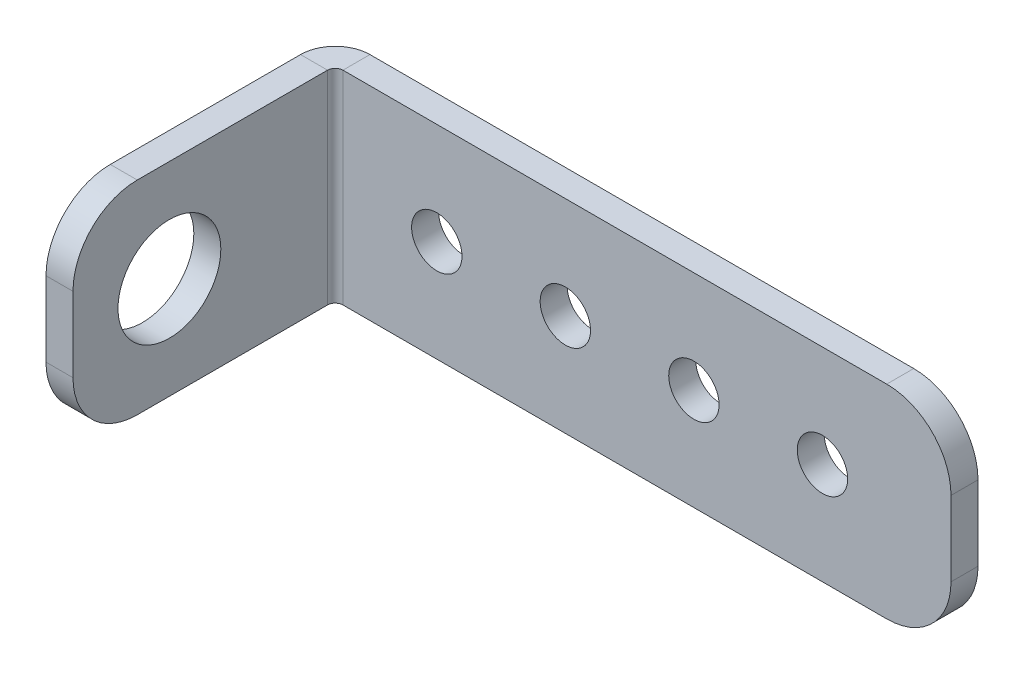
ISO-10303-21;
HEADER;
FILE_DESCRIPTION(('STEP AP214'),'2;1');
FILE_NAME('part.step','',(''),(''),'','','');
FILE_SCHEMA(('AUTOMOTIVE_DESIGN { 1 0 10303 214 1 1 1 1 }'));
ENDSEC;
DATA;
#1=APPLICATION_CONTEXT('core data for automotive mechanical design processes');
#2=APPLICATION_PROTOCOL_DEFINITION('international standard','automotive_design',2000,#1);
#3=PRODUCT_CONTEXT('',#1,'mechanical');
#4=PRODUCT('Part','Part','',(#3));
#5=PRODUCT_RELATED_PRODUCT_CATEGORY('part','',(#4));
#6=PRODUCT_DEFINITION_FORMATION('','',#4);
#7=PRODUCT_DEFINITION_CONTEXT('part definition',#1,'design');
#8=PRODUCT_DEFINITION('design','',#6,#7);
#9=PRODUCT_DEFINITION_SHAPE('','',#8);
#10=(LENGTH_UNIT() NAMED_UNIT(*) SI_UNIT(.MILLI.,.METRE.));
#11=(NAMED_UNIT(*) PLANE_ANGLE_UNIT() SI_UNIT($,.RADIAN.));
#12=(NAMED_UNIT(*) SI_UNIT($,.STERADIAN.) SOLID_ANGLE_UNIT());
#13=UNCERTAINTY_MEASURE_WITH_UNIT(LENGTH_MEASURE(1.E-05),#10,'distance_accuracy_value','');
#14=(GEOMETRIC_REPRESENTATION_CONTEXT(3) GLOBAL_UNCERTAINTY_ASSIGNED_CONTEXT((#13)) GLOBAL_UNIT_ASSIGNED_CONTEXT((#10,
#11,#12)) REPRESENTATION_CONTEXT('',''));
#15=CARTESIAN_POINT('',(0.,0.,0.));
#16=DIRECTION('',(0.,0.,1.));
#17=DIRECTION('',(1.,0.,0.));
#18=AXIS2_PLACEMENT_3D('',#15,#16,#17);
#19=CARTESIAN_POINT('',(3.429,20.0914,0.));
#20=DIRECTION('',(0.,1.,0.));
#21=DIRECTION('',(0.,0.,1.));
#22=AXIS2_PLACEMENT_3D('',#19,#20,#21);
#23=PLANE('',#22);
#24=DIRECTION('',(0.,0.,1.));
#25=VECTOR('',#24,1.);
#26=CARTESIAN_POINT('',(3.429,20.0914,0.));
#27=LINE('',#26,#25);
#28=CARTESIAN_POINT('',(3.429,20.0914,0.));
#29=VERTEX_POINT('',#28);
#30=CARTESIAN_POINT('',(3.429,20.0914,2.667));
#31=VERTEX_POINT('',#30);
#32=EDGE_CURVE('E135',#29,#31,#27,.T.);
#33=ORIENTED_EDGE('',*,*,#32,.F.);
#34=CARTESIAN_POINT('',(3.429,20.0914,3.429));
#35=DIRECTION('',(0.,1.,0.));
#36=DIRECTION('',(0.,0.,1.));
#37=AXIS2_PLACEMENT_3D('',#34,#35,#36);
#38=CIRCLE('',#37,3.429);
#39=CARTESIAN_POINT('',(0.,20.0914,3.429));
#40=VERTEX_POINT('',#39);
#41=EDGE_CURVE('E139',#40,#29,#38,.F.);
#42=ORIENTED_EDGE('',*,*,#41,.F.);
#43=DIRECTION('',(-1.,0.,0.));
#44=VECTOR('',#43,1.);
#45=CARTESIAN_POINT('',(2.667,20.0914,3.429));
#46=LINE('',#45,#44);
#47=CARTESIAN_POINT('',(2.667,20.0914,3.429));
#48=VERTEX_POINT('',#47);
#49=EDGE_CURVE('E147',#48,#40,#46,.T.);
#50=ORIENTED_EDGE('',*,*,#49,.F.);
#51=CARTESIAN_POINT('',(3.429,20.0914,3.429));
#52=DIRECTION('',(0.,1.,0.));
#53=DIRECTION('',(1.,0.,0.));
#54=AXIS2_PLACEMENT_3D('',#51,#52,#53);
#55=CIRCLE('',#54,0.762);
#56=EDGE_CURVE('E141',#48,#31,#55,.F.);
#57=ORIENTED_EDGE('',*,*,#56,.T.);
#58=EDGE_LOOP('',(#33,#42,#50,#57));
#59=FACE_BOUND('',#58,.T.);
#60=ADVANCED_FACE('F45',(#59),#23,.T.);
#61=CARTESIAN_POINT('',(2.667,20.0914,3.429));
#62=DIRECTION('',(0.,1.,0.));
#63=DIRECTION('',(0.,0.,1.));
#64=AXIS2_PLACEMENT_3D('',#61,#62,#63);
#65=PLANE('',#64);
#66=DIRECTION('',(1.,0.,0.));
#67=VECTOR('',#66,1.);
#68=CARTESIAN_POINT('',(0.,20.0914,2.667));
#69=LINE('',#68,#67);
#70=CARTESIAN_POINT('',(57.15,20.0914,2.667));
#71=VERTEX_POINT('',#70);
#72=EDGE_CURVE('E168',#31,#71,#69,.T.);
#73=ORIENTED_EDGE('',*,*,#72,.T.);
#74=DIRECTION('',(0.,0.,1.));
#75=VECTOR('',#74,1.);
#76=CARTESIAN_POINT('',(57.15,20.0914,3.429));
#77=LINE('',#76,#75);
#78=CARTESIAN_POINT('',(57.15,20.0914,0.));
#79=VERTEX_POINT('',#78);
#80=EDGE_CURVE('E167',#71,#79,#77,.F.);
#81=ORIENTED_EDGE('',*,*,#80,.T.);
#82=DIRECTION('',(1.,0.,0.));
#83=VECTOR('',#82,1.);
#84=CARTESIAN_POINT('',(0.,20.0914,0.));
#85=LINE('',#84,#83);
#86=EDGE_CURVE('E155',#29,#79,#85,.T.);
#87=ORIENTED_EDGE('',*,*,#86,.F.);
#88=ORIENTED_EDGE('',*,*,#32,.T.);
#89=EDGE_LOOP('',(#73,#81,#87,#88));
#90=FACE_BOUND('',#89,.T.);
#91=ADVANCED_FACE('F165',(#90),#65,.T.);
#92=CARTESIAN_POINT('',(0.,0.,3.429));
#93=DIRECTION('',(0.,-1.,0.));
#94=DIRECTION('',(0.,0.,-1.));
#95=AXIS2_PLACEMENT_3D('',#92,#93,#94);
#96=PLANE('',#95);
#97=DIRECTION('',(1.,0.,0.));
#98=VECTOR('',#97,1.);
#99=CARTESIAN_POINT('',(0.,0.,3.429));
#100=LINE('',#99,#98);
#101=CARTESIAN_POINT('',(0.,0.,3.429));
#102=VERTEX_POINT('',#101);
#103=CARTESIAN_POINT('',(2.667,0.,3.429));
#104=VERTEX_POINT('',#103);
#105=EDGE_CURVE('E213',#102,#104,#100,.T.);
#106=ORIENTED_EDGE('',*,*,#105,.F.);
#107=CARTESIAN_POINT('',(3.429,0.,3.429));
#108=DIRECTION('',(0.,1.,0.));
#109=DIRECTION('',(0.,0.,1.));
#110=AXIS2_PLACEMENT_3D('',#107,#108,#109);
#111=CIRCLE('',#110,3.429);
#112=CARTESIAN_POINT('',(3.429,0.,0.));
#113=VERTEX_POINT('',#112);
#114=EDGE_CURVE('E187',#102,#113,#111,.F.);
#115=ORIENTED_EDGE('',*,*,#114,.T.);
#116=DIRECTION('',(0.,0.,-1.));
#117=VECTOR('',#116,1.);
#118=CARTESIAN_POINT('',(3.429,0.,2.667));
#119=LINE('',#118,#117);
#120=CARTESIAN_POINT('',(3.429,0.,2.667));
#121=VERTEX_POINT('',#120);
#122=EDGE_CURVE('E211',#121,#113,#119,.T.);
#123=ORIENTED_EDGE('',*,*,#122,.F.);
#124=CARTESIAN_POINT('',(3.429,0.,3.429));
#125=DIRECTION('',(0.,1.,0.));
#126=DIRECTION('',(1.,0.,0.));
#127=AXIS2_PLACEMENT_3D('',#124,#125,#126);
#128=CIRCLE('',#127,0.762);
#129=EDGE_CURVE('E193',#104,#121,#128,.F.);
#130=ORIENTED_EDGE('',*,*,#129,.F.);
#131=EDGE_LOOP('',(#106,#115,#123,#130));
#132=FACE_BOUND('',#131,.T.);
#133=ADVANCED_FACE('F335',(#132),#96,.T.);
#134=CARTESIAN_POINT('',(3.429,0.,2.667));
#135=DIRECTION('',(0.,-1.,0.));
#136=DIRECTION('',(0.,0.,-1.));
#137=AXIS2_PLACEMENT_3D('',#134,#135,#136);
#138=PLANE('',#137);
#139=DIRECTION('',(0.,0.,-1.));
#140=VECTOR('',#139,1.);
#141=CARTESIAN_POINT('',(2.667,0.,28.575));
#142=LINE('',#141,#140);
#143=CARTESIAN_POINT('',(2.667,0.,22.225));
#144=VERTEX_POINT('',#143);
#145=EDGE_CURVE('E191',#144,#104,#142,.T.);
#146=ORIENTED_EDGE('',*,*,#145,.F.);
#147=DIRECTION('',(-1.,0.,0.));
#148=VECTOR('',#147,1.);
#149=CARTESIAN_POINT('',(3.429,0.,22.225));
#150=LINE('',#149,#148);
#151=CARTESIAN_POINT('',(0.,0.,22.225));
#152=VERTEX_POINT('',#151);
#153=EDGE_CURVE('E234',#144,#152,#150,.T.);
#154=ORIENTED_EDGE('',*,*,#153,.T.);
#155=DIRECTION('',(0.,0.,-1.));
#156=VECTOR('',#155,1.);
#157=CARTESIAN_POINT('',(0.,0.,28.575));
#158=LINE('',#157,#156);
#159=EDGE_CURVE('E189',#152,#102,#158,.T.);
#160=ORIENTED_EDGE('',*,*,#159,.T.);
#161=ORIENTED_EDGE('',*,*,#105,.T.);
#162=EDGE_LOOP('',(#146,#154,#160,#161));
#163=FACE_BOUND('',#162,.T.);
#164=ADVANCED_FACE('F254',(#163),#138,.T.);
#165=CARTESIAN_POINT('',(0.,20.0914,2.667));
#166=DIRECTION('',(0.,0.,-1.));
#167=DIRECTION('',(-1.,0.,0.));
#168=AXIS2_PLACEMENT_3D('',#165,#166,#167);
#169=PLANE('',#168);
#170=CARTESIAN_POINT('',(50.8,10.0457,2.667));
#171=DIRECTION('',(0.,0.,-1.));
#172=DIRECTION('',(-1.,0.,0.));
#173=AXIS2_PLACEMENT_3D('',#170,#171,#172);
#174=CIRCLE('',#173,2.4892);
#175=CARTESIAN_POINT('',(48.3108,10.0457,2.667));
#176=VERTEX_POINT('',#175);
#177=EDGE_CURVE('E278',#176,#176,#174,.T.);
#178=ORIENTED_EDGE('',*,*,#177,.T.);
#179=EDGE_LOOP('',(#178));
#180=FACE_BOUND('',#179,.T.);
#181=CARTESIAN_POINT('',(38.1,10.0457,2.667));
#182=DIRECTION('',(0.,0.,-1.));
#183=DIRECTION('',(-1.,0.,0.));
#184=AXIS2_PLACEMENT_3D('',#181,#182,#183);
#185=CIRCLE('',#184,2.48919999999999);
#186=CARTESIAN_POINT('',(35.6108,10.0457,2.667));
#187=VERTEX_POINT('',#186);
#188=EDGE_CURVE('E283',#187,#187,#185,.T.);
#189=ORIENTED_EDGE('',*,*,#188,.T.);
#190=EDGE_LOOP('',(#189));
#191=FACE_BOUND('',#190,.T.);
#192=CARTESIAN_POINT('',(25.4,10.0457,2.667));
#193=DIRECTION('',(0.,0.,-1.));
#194=DIRECTION('',(-1.,0.,0.));
#195=AXIS2_PLACEMENT_3D('',#192,#193,#194);
#196=CIRCLE('',#195,2.4892);
#197=CARTESIAN_POINT('',(22.9108,10.0457,2.667));
#198=VERTEX_POINT('',#197);
#199=EDGE_CURVE('E286',#198,#198,#196,.T.);
#200=ORIENTED_EDGE('',*,*,#199,.T.);
#201=EDGE_LOOP('',(#200));
#202=FACE_BOUND('',#201,.T.);
#203=CARTESIAN_POINT('',(12.7,10.0457,2.667));
#204=DIRECTION('',(0.,0.,-1.));
#205=DIRECTION('',(-1.,0.,0.));
#206=AXIS2_PLACEMENT_3D('',#203,#204,#205);
#207=CIRCLE('',#206,2.4892);
#208=CARTESIAN_POINT('',(10.2108,10.0457,2.667));
#209=VERTEX_POINT('',#208);
#210=EDGE_CURVE('E289',#209,#209,#207,.T.);
#211=ORIENTED_EDGE('',*,*,#210,.T.);
#212=EDGE_LOOP('',(#211));
#213=FACE_BOUND('',#212,.T.);
#214=DIRECTION('',(0.,-1.,0.));
#215=VECTOR('',#214,1.);
#216=CARTESIAN_POINT('',(63.5,20.0914,2.667));
#217=LINE('',#216,#215);
#218=CARTESIAN_POINT('',(63.5,13.7414,2.667));
#219=VERTEX_POINT('',#218);
#220=CARTESIAN_POINT('',(63.5,6.35,2.667));
#221=VERTEX_POINT('',#220);
#222=EDGE_CURVE('E208',#219,#221,#217,.T.);
#223=ORIENTED_EDGE('',*,*,#222,.F.);
#224=CARTESIAN_POINT('',(57.15,13.7414,2.667));
#225=DIRECTION('',(0.,0.,-1.));
#226=DIRECTION('',(-1.,0.,0.));
#227=AXIS2_PLACEMENT_3D('',#224,#225,#226);
#228=CIRCLE('',#227,6.35);
#229=EDGE_CURVE('E224',#219,#71,#228,.F.);
#230=ORIENTED_EDGE('',*,*,#229,.T.);
#231=ORIENTED_EDGE('',*,*,#72,.F.);
#232=DIRECTION('',(0.,-1.,0.));
#233=VECTOR('',#232,1.);
#234=CARTESIAN_POINT('',(3.429,20.0914,2.667));
#235=LINE('',#234,#233);
#236=EDGE_CURVE('E181',#31,#121,#235,.T.);
#237=ORIENTED_EDGE('',*,*,#236,.T.);
#238=DIRECTION('',(1.,0.,0.));
#239=VECTOR('',#238,1.);
#240=CARTESIAN_POINT('',(0.,0.,2.667));
#241=LINE('',#240,#239);
#242=CARTESIAN_POINT('',(57.15,0.,2.667));
#243=VERTEX_POINT('',#242);
#244=EDGE_CURVE('E182',#121,#243,#241,.T.);
#245=ORIENTED_EDGE('',*,*,#244,.T.);
#246=CARTESIAN_POINT('',(57.15,6.35,2.667));
#247=DIRECTION('',(0.,0.,-1.));
#248=DIRECTION('',(-1.,0.,0.));
#249=AXIS2_PLACEMENT_3D('',#246,#247,#248);
#250=CIRCLE('',#249,6.35);
#251=EDGE_CURVE('E222',#243,#221,#250,.F.);
#252=ORIENTED_EDGE('',*,*,#251,.T.);
#253=EDGE_LOOP('',(#223,#230,#231,#237,#245,#252));
#254=FACE_BOUND('',#253,.T.);
#255=ADVANCED_FACE('F273',(#180,#191,#202,#213,#254),#169,.F.);
#256=CARTESIAN_POINT('',(63.5,20.0914,0.));
#257=DIRECTION('',(1.,0.,0.));
#258=DIRECTION('',(0.,0.,-1.));
#259=AXIS2_PLACEMENT_3D('',#256,#257,#258);
#260=PLANE('',#259);
#261=DIRECTION('',(0.,-1.,0.));
#262=VECTOR('',#261,1.);
#263=CARTESIAN_POINT('',(63.5,20.0914,0.));
#264=LINE('',#263,#262);
#265=CARTESIAN_POINT('',(63.5,13.7414,0.));
#266=VERTEX_POINT('',#265);
#267=CARTESIAN_POINT('',(63.5,6.35,0.));
#268=VERTEX_POINT('',#267);
#269=EDGE_CURVE('E162',#266,#268,#264,.T.);
#270=ORIENTED_EDGE('',*,*,#269,.F.);
#271=DIRECTION('',(0.,0.,1.));
#272=VECTOR('',#271,1.);
#273=CARTESIAN_POINT('',(63.5,13.7414,0.));
#274=LINE('',#273,#272);
#275=EDGE_CURVE('E219',#266,#219,#274,.T.);
#276=ORIENTED_EDGE('',*,*,#275,.T.);
#277=ORIENTED_EDGE('',*,*,#222,.T.);
#278=DIRECTION('',(0.,0.,1.));
#279=VECTOR('',#278,1.);
#280=CARTESIAN_POINT('',(63.5,6.35,0.));
#281=LINE('',#280,#279);
#282=EDGE_CURVE('E146',#221,#268,#281,.F.);
#283=ORIENTED_EDGE('',*,*,#282,.T.);
#284=EDGE_LOOP('',(#270,#276,#277,#283));
#285=FACE_BOUND('',#284,.T.);
#286=ADVANCED_FACE('F310',(#285),#260,.T.);
#287=CARTESIAN_POINT('',(0.,20.0914,0.));
#288=DIRECTION('',(0.,0.,-1.));
#289=DIRECTION('',(-1.,0.,0.));
#290=AXIS2_PLACEMENT_3D('',#287,#288,#289);
#291=PLANE('',#290);
#292=CARTESIAN_POINT('',(50.8,10.0457,0.));
#293=DIRECTION('',(0.,0.,-1.));
#294=DIRECTION('',(-1.,0.,0.));
#295=AXIS2_PLACEMENT_3D('',#292,#293,#294);
#296=CIRCLE('',#295,2.4892);
#297=CARTESIAN_POINT('',(48.3108,10.0457,0.));
#298=VERTEX_POINT('',#297);
#299=EDGE_CURVE('E292',#298,#298,#296,.T.);
#300=ORIENTED_EDGE('',*,*,#299,.F.);
#301=EDGE_LOOP('',(#300));
#302=FACE_BOUND('',#301,.T.);
#303=CARTESIAN_POINT('',(38.1,10.0457,0.));
#304=DIRECTION('',(0.,0.,-1.));
#305=DIRECTION('',(-1.,0.,0.));
#306=AXIS2_PLACEMENT_3D('',#303,#304,#305);
#307=CIRCLE('',#306,2.48919999999999);
#308=CARTESIAN_POINT('',(35.6108,10.0457,0.));
#309=VERTEX_POINT('',#308);
#310=EDGE_CURVE('E299',#309,#309,#307,.T.);
#311=ORIENTED_EDGE('',*,*,#310,.F.);
#312=EDGE_LOOP('',(#311));
#313=FACE_BOUND('',#312,.T.);
#314=CARTESIAN_POINT('',(25.4,10.0457,0.));
#315=DIRECTION('',(0.,0.,-1.));
#316=DIRECTION('',(-1.,0.,0.));
#317=AXIS2_PLACEMENT_3D('',#314,#315,#316);
#318=CIRCLE('',#317,2.4892);
#319=CARTESIAN_POINT('',(22.9108,10.0457,0.));
#320=VERTEX_POINT('',#319);
#321=EDGE_CURVE('E296',#320,#320,#318,.T.);
#322=ORIENTED_EDGE('',*,*,#321,.F.);
#323=EDGE_LOOP('',(#322));
#324=FACE_BOUND('',#323,.T.);
#325=CARTESIAN_POINT('',(12.7,10.0457,0.));
#326=DIRECTION('',(0.,0.,-1.));
#327=DIRECTION('',(-1.,0.,0.));
#328=AXIS2_PLACEMENT_3D('',#325,#326,#327);
#329=CIRCLE('',#328,2.4892);
#330=CARTESIAN_POINT('',(10.2108,10.0457,0.));
#331=VERTEX_POINT('',#330);
#332=EDGE_CURVE('E293',#331,#331,#329,.T.);
#333=ORIENTED_EDGE('',*,*,#332,.F.);
#334=EDGE_LOOP('',(#333));
#335=FACE_BOUND('',#334,.T.);
#336=ORIENTED_EDGE('',*,*,#86,.T.);
#337=CARTESIAN_POINT('',(57.15,13.7414,0.));
#338=DIRECTION('',(0.,0.,-1.));
#339=DIRECTION('',(-1.,0.,0.));
#340=AXIS2_PLACEMENT_3D('',#337,#338,#339);
#341=CIRCLE('',#340,6.35);
#342=EDGE_CURVE('E229',#79,#266,#341,.T.);
#343=ORIENTED_EDGE('',*,*,#342,.T.);
#344=ORIENTED_EDGE('',*,*,#269,.T.);
#345=CARTESIAN_POINT('',(57.15,6.35,0.));
#346=DIRECTION('',(0.,0.,-1.));
#347=DIRECTION('',(-1.,0.,0.));
#348=AXIS2_PLACEMENT_3D('',#345,#346,#347);
#349=CIRCLE('',#348,6.35);
#350=CARTESIAN_POINT('',(57.15,0.,0.));
#351=VERTEX_POINT('',#350);
#352=EDGE_CURVE('E227',#268,#351,#349,.T.);
#353=ORIENTED_EDGE('',*,*,#352,.T.);
#354=DIRECTION('',(1.,0.,0.));
#355=VECTOR('',#354,1.);
#356=CARTESIAN_POINT('',(0.,0.,0.));
#357=LINE('',#356,#355);
#358=EDGE_CURVE('E158',#113,#351,#357,.T.);
#359=ORIENTED_EDGE('',*,*,#358,.F.);
#360=DIRECTION('',(0.,-1.,0.));
#361=VECTOR('',#360,1.);
#362=CARTESIAN_POINT('',(3.429,20.0914,0.));
#363=LINE('',#362,#361);
#364=EDGE_CURVE('E153',#29,#113,#363,.T.);
#365=ORIENTED_EDGE('',*,*,#364,.F.);
#366=EDGE_LOOP('',(#336,#343,#344,#353,#359,#365));
#367=FACE_BOUND('',#366,.T.);
#368=ADVANCED_FACE('F154',(#302,#313,#324,#335,#367),#291,.T.);
#369=CARTESIAN_POINT('',(3.429,20.0914,3.429));
#370=DIRECTION('',(0.,-1.,0.));
#371=DIRECTION('',(0.,0.,-1.));
#372=AXIS2_PLACEMENT_3D('',#369,#370,#371);
#373=CYLINDRICAL_SURFACE('',#372,3.429);
#374=ORIENTED_EDGE('',*,*,#114,.F.);
#375=DIRECTION('',(0.,-1.,0.));
#376=VECTOR('',#375,1.);
#377=CARTESIAN_POINT('',(0.,20.0914,3.429));
#378=LINE('',#377,#376);
#379=EDGE_CURVE('E163',#40,#102,#378,.T.);
#380=ORIENTED_EDGE('',*,*,#379,.F.);
#381=ORIENTED_EDGE('',*,*,#41,.T.);
#382=ORIENTED_EDGE('',*,*,#364,.T.);
#383=EDGE_LOOP('',(#374,#380,#381,#382));
#384=FACE_BOUND('',#383,.T.);
#385=ADVANCED_FACE('F171',(#384),#373,.T.);
#386=CARTESIAN_POINT('',(0.,20.0914,28.575));
#387=DIRECTION('',(-1.,0.,0.));
#388=DIRECTION('',(0.,0.,1.));
#389=AXIS2_PLACEMENT_3D('',#386,#387,#388);
#390=PLANE('',#389);
#391=CARTESIAN_POINT('',(0.,10.0457,19.05));
#392=DIRECTION('',(1.,0.,0.));
#393=DIRECTION('',(0.,0.,-1.));
#394=AXIS2_PLACEMENT_3D('',#391,#392,#393);
#395=CIRCLE('',#394,5.08);
#396=CARTESIAN_POINT('',(0.,10.0457,13.97));
#397=VERTEX_POINT('',#396);
#398=EDGE_CURVE('E185',#397,#397,#395,.T.);
#399=ORIENTED_EDGE('',*,*,#398,.T.);
#400=EDGE_LOOP('',(#399));
#401=FACE_BOUND('',#400,.T.);
#402=ORIENTED_EDGE('',*,*,#159,.F.);
#403=CARTESIAN_POINT('',(0.,6.35,22.225));
#404=DIRECTION('',(-1.,0.,0.));
#405=DIRECTION('',(0.,0.,1.));
#406=AXIS2_PLACEMENT_3D('',#403,#404,#405);
#407=CIRCLE('',#406,6.35);
#408=CARTESIAN_POINT('',(0.,6.35,28.575));
#409=VERTEX_POINT('',#408);
#410=EDGE_CURVE('E239',#152,#409,#407,.T.);
#411=ORIENTED_EDGE('',*,*,#410,.T.);
#412=DIRECTION('',(0.,-1.,0.));
#413=VECTOR('',#412,1.);
#414=CARTESIAN_POINT('',(0.,20.0914,28.575));
#415=LINE('',#414,#413);
#416=CARTESIAN_POINT('',(0.,13.7414,28.575));
#417=VERTEX_POINT('',#416);
#418=EDGE_CURVE('E203',#417,#409,#415,.T.);
#419=ORIENTED_EDGE('',*,*,#418,.F.);
#420=CARTESIAN_POINT('',(0.,13.7414,22.225));
#421=DIRECTION('',(-1.,0.,0.));
#422=DIRECTION('',(0.,0.,1.));
#423=AXIS2_PLACEMENT_3D('',#420,#421,#422);
#424=CIRCLE('',#423,6.35);
#425=CARTESIAN_POINT('',(0.,20.0914,22.225));
#426=VERTEX_POINT('',#425);
#427=EDGE_CURVE('E237',#417,#426,#424,.T.);
#428=ORIENTED_EDGE('',*,*,#427,.T.);
#429=DIRECTION('',(0.,0.,-1.));
#430=VECTOR('',#429,1.);
#431=CARTESIAN_POINT('',(0.,20.0914,28.575));
#432=LINE('',#431,#430);
#433=EDGE_CURVE('E173',#426,#40,#432,.T.);
#434=ORIENTED_EDGE('',*,*,#433,.T.);
#435=ORIENTED_EDGE('',*,*,#379,.T.);
#436=EDGE_LOOP('',(#402,#411,#419,#428,#434,#435));
#437=FACE_BOUND('',#436,.T.);
#438=ADVANCED_FACE('F260',(#401,#437),#390,.T.);
#439=CARTESIAN_POINT('',(2.667,20.0914,28.575));
#440=DIRECTION('',(0.,0.,1.));
#441=DIRECTION('',(1.,0.,0.));
#442=AXIS2_PLACEMENT_3D('',#439,#440,#441);
#443=PLANE('',#442);
#444=ORIENTED_EDGE('',*,*,#418,.T.);
#445=DIRECTION('',(-1.,0.,0.));
#446=VECTOR('',#445,1.);
#447=CARTESIAN_POINT('',(2.667,6.35,28.575));
#448=LINE('',#447,#446);
#449=CARTESIAN_POINT('',(2.667,6.35,28.575));
#450=VERTEX_POINT('',#449);
#451=EDGE_CURVE('E66',#409,#450,#448,.F.);
#452=ORIENTED_EDGE('',*,*,#451,.T.);
#453=DIRECTION('',(0.,-1.,0.));
#454=VECTOR('',#453,1.);
#455=CARTESIAN_POINT('',(2.667,20.0914,28.575));
#456=LINE('',#455,#454);
#457=CARTESIAN_POINT('',(2.667,13.7414,28.575));
#458=VERTEX_POINT('',#457);
#459=EDGE_CURVE('E201',#458,#450,#456,.T.);
#460=ORIENTED_EDGE('',*,*,#459,.F.);
#461=DIRECTION('',(-1.,0.,0.));
#462=VECTOR('',#461,1.);
#463=CARTESIAN_POINT('',(2.667,13.7414,28.575));
#464=LINE('',#463,#462);
#465=EDGE_CURVE('E241',#458,#417,#464,.T.);
#466=ORIENTED_EDGE('',*,*,#465,.T.);
#467=EDGE_LOOP('',(#444,#452,#460,#466));
#468=FACE_BOUND('',#467,.T.);
#469=ADVANCED_FACE('F261',(#468),#443,.T.);
#470=CARTESIAN_POINT('',(2.667,20.0914,28.575));
#471=DIRECTION('',(-1.,0.,0.));
#472=DIRECTION('',(0.,0.,1.));
#473=AXIS2_PLACEMENT_3D('',#470,#471,#472);
#474=PLANE('',#473);
#475=CARTESIAN_POINT('',(2.667,10.0457,19.05));
#476=DIRECTION('',(1.,0.,0.));
#477=DIRECTION('',(0.,0.,-1.));
#478=AXIS2_PLACEMENT_3D('',#475,#476,#477);
#479=CIRCLE('',#478,5.08);
#480=CARTESIAN_POINT('',(2.667,10.0457,13.97));
#481=VERTEX_POINT('',#480);
#482=EDGE_CURVE('E275',#481,#481,#479,.T.);
#483=ORIENTED_EDGE('',*,*,#482,.F.);
#484=EDGE_LOOP('',(#483));
#485=FACE_BOUND('',#484,.T.);
#486=ORIENTED_EDGE('',*,*,#459,.T.);
#487=CARTESIAN_POINT('',(2.667,6.35,22.225));
#488=DIRECTION('',(-1.,0.,0.));
#489=DIRECTION('',(0.,0.,1.));
#490=AXIS2_PLACEMENT_3D('',#487,#488,#489);
#491=CIRCLE('',#490,6.35);
#492=EDGE_CURVE('E53',#450,#144,#491,.F.);
#493=ORIENTED_EDGE('',*,*,#492,.T.);
#494=ORIENTED_EDGE('',*,*,#145,.T.);
#495=DIRECTION('',(0.,-1.,0.));
#496=VECTOR('',#495,1.);
#497=CARTESIAN_POINT('',(2.667,20.0914,3.429));
#498=LINE('',#497,#496);
#499=EDGE_CURVE('E198',#48,#104,#498,.T.);
#500=ORIENTED_EDGE('',*,*,#499,.F.);
#501=DIRECTION('',(0.,0.,-1.));
#502=VECTOR('',#501,1.);
#503=CARTESIAN_POINT('',(2.667,20.0914,28.575));
#504=LINE('',#503,#502);
#505=CARTESIAN_POINT('',(2.667,20.0914,22.225));
#506=VERTEX_POINT('',#505);
#507=EDGE_CURVE('E175',#506,#48,#504,.T.);
#508=ORIENTED_EDGE('',*,*,#507,.F.);
#509=CARTESIAN_POINT('',(2.667,13.7414,22.225));
#510=DIRECTION('',(-1.,0.,0.));
#511=DIRECTION('',(0.,0.,1.));
#512=AXIS2_PLACEMENT_3D('',#509,#510,#511);
#513=CIRCLE('',#512,6.35);
#514=EDGE_CURVE('E245',#506,#458,#513,.F.);
#515=ORIENTED_EDGE('',*,*,#514,.T.);
#516=EDGE_LOOP('',(#486,#493,#494,#500,#508,#515));
#517=FACE_BOUND('',#516,.T.);
#518=ADVANCED_FACE('F249',(#485,#517),#474,.F.);
#519=CARTESIAN_POINT('',(3.429,20.0914,3.429));
#520=DIRECTION('',(0.,-1.,0.));
#521=DIRECTION('',(0.,0.,-1.));
#522=AXIS2_PLACEMENT_3D('',#519,#520,#521);
#523=CYLINDRICAL_SURFACE('',#522,0.762);
#524=ORIENTED_EDGE('',*,*,#129,.T.);
#525=ORIENTED_EDGE('',*,*,#236,.F.);
#526=ORIENTED_EDGE('',*,*,#56,.F.);
#527=ORIENTED_EDGE('',*,*,#499,.T.);
#528=EDGE_LOOP('',(#524,#525,#526,#527));
#529=FACE_BOUND('',#528,.T.);
#530=ADVANCED_FACE('F268',(#529),#523,.F.);
#531=CARTESIAN_POINT('',(3.429,20.0914,3.429));
#532=DIRECTION('',(0.,1.,0.));
#533=DIRECTION('',(1.,0.,0.));
#534=AXIS2_PLACEMENT_3D('',#531,#532,#533);
#535=PLANE('',#534);
#536=ORIENTED_EDGE('',*,*,#433,.F.);
#537=DIRECTION('',(-1.,0.,0.));
#538=VECTOR('',#537,1.);
#539=CARTESIAN_POINT('',(3.429,20.0914,22.225));
#540=LINE('',#539,#538);
#541=EDGE_CURVE('E11',#426,#506,#540,.F.);
#542=ORIENTED_EDGE('',*,*,#541,.T.);
#543=ORIENTED_EDGE('',*,*,#507,.T.);
#544=ORIENTED_EDGE('',*,*,#49,.T.);
#545=EDGE_LOOP('',(#536,#542,#543,#544));
#546=FACE_BOUND('',#545,.T.);
#547=ADVANCED_FACE('F265',(#546),#535,.T.);
#548=CARTESIAN_POINT('',(3.429,0.,3.429));
#549=DIRECTION('',(0.,1.,0.));
#550=DIRECTION('',(1.,0.,0.));
#551=AXIS2_PLACEMENT_3D('',#548,#549,#550);
#552=PLANE('',#551);
#553=ORIENTED_EDGE('',*,*,#358,.T.);
#554=DIRECTION('',(0.,0.,1.));
#555=VECTOR('',#554,1.);
#556=CARTESIAN_POINT('',(57.15,0.,2.667));
#557=LINE('',#556,#555);
#558=EDGE_CURVE('E231',#351,#243,#557,.T.);
#559=ORIENTED_EDGE('',*,*,#558,.T.);
#560=ORIENTED_EDGE('',*,*,#244,.F.);
#561=ORIENTED_EDGE('',*,*,#122,.T.);
#562=EDGE_LOOP('',(#553,#559,#560,#561));
#563=FACE_BOUND('',#562,.T.);
#564=ADVANCED_FACE('F414',(#563),#552,.F.);
#565=CARTESIAN_POINT('',(0.,10.0457,19.05));
#566=DIRECTION('',(1.,0.,0.));
#567=DIRECTION('',(0.,0.,-1.));
#568=AXIS2_PLACEMENT_3D('',#565,#566,#567);
#569=CYLINDRICAL_SURFACE('',#568,5.08);
#570=ORIENTED_EDGE('',*,*,#398,.F.);
#571=EDGE_LOOP('',(#570));
#572=FACE_BOUND('',#571,.T.);
#573=ORIENTED_EDGE('',*,*,#482,.T.);
#574=EDGE_LOOP('',(#573));
#575=FACE_BOUND('',#574,.T.);
#576=ADVANCED_FACE('F351',(#572,#575),#569,.F.);
#577=CARTESIAN_POINT('',(57.15,13.7414,0.));
#578=DIRECTION('',(0.,0.,1.));
#579=DIRECTION('',(1.,0.,0.));
#580=AXIS2_PLACEMENT_3D('',#577,#578,#579);
#581=CYLINDRICAL_SURFACE('',#580,6.35);
#582=ORIENTED_EDGE('',*,*,#342,.F.);
#583=ORIENTED_EDGE('',*,*,#80,.F.);
#584=ORIENTED_EDGE('',*,*,#229,.F.);
#585=ORIENTED_EDGE('',*,*,#275,.F.);
#586=EDGE_LOOP('',(#582,#583,#584,#585));
#587=FACE_BOUND('',#586,.T.);
#588=ADVANCED_FACE('F347',(#587),#581,.T.);
#589=CARTESIAN_POINT('',(57.15,6.35,3.429));
#590=DIRECTION('',(0.,0.,-1.));
#591=DIRECTION('',(-1.,0.,0.));
#592=AXIS2_PLACEMENT_3D('',#589,#590,#591);
#593=CYLINDRICAL_SURFACE('',#592,6.35);
#594=ORIENTED_EDGE('',*,*,#352,.F.);
#595=ORIENTED_EDGE('',*,*,#282,.F.);
#596=ORIENTED_EDGE('',*,*,#251,.F.);
#597=ORIENTED_EDGE('',*,*,#558,.F.);
#598=EDGE_LOOP('',(#594,#595,#596,#597));
#599=FACE_BOUND('',#598,.T.);
#600=ADVANCED_FACE('F350',(#599),#593,.T.);
#601=CARTESIAN_POINT('',(3.429,6.35,22.225));
#602=DIRECTION('',(-1.,0.,0.));
#603=DIRECTION('',(0.,0.,1.));
#604=AXIS2_PLACEMENT_3D('',#601,#602,#603);
#605=CYLINDRICAL_SURFACE('',#604,6.35);
#606=ORIENTED_EDGE('',*,*,#492,.F.);
#607=ORIENTED_EDGE('',*,*,#451,.F.);
#608=ORIENTED_EDGE('',*,*,#410,.F.);
#609=ORIENTED_EDGE('',*,*,#153,.F.);
#610=EDGE_LOOP('',(#606,#607,#608,#609));
#611=FACE_BOUND('',#610,.T.);
#612=ADVANCED_FACE('F257',(#611),#605,.T.);
#613=CARTESIAN_POINT('',(2.667,13.7414,22.225));
#614=DIRECTION('',(-1.,0.,0.));
#615=DIRECTION('',(0.,0.,1.));
#616=AXIS2_PLACEMENT_3D('',#613,#614,#615);
#617=CYLINDRICAL_SURFACE('',#616,6.35);
#618=ORIENTED_EDGE('',*,*,#514,.F.);
#619=ORIENTED_EDGE('',*,*,#541,.F.);
#620=ORIENTED_EDGE('',*,*,#427,.F.);
#621=ORIENTED_EDGE('',*,*,#465,.F.);
#622=EDGE_LOOP('',(#618,#619,#620,#621));
#623=FACE_BOUND('',#622,.T.);
#624=ADVANCED_FACE('F47',(#623),#617,.T.);
#625=CARTESIAN_POINT('',(12.7,10.0457,28.575));
#626=DIRECTION('',(0.,0.,-1.));
#627=DIRECTION('',(-1.,0.,0.));
#628=AXIS2_PLACEMENT_3D('',#625,#626,#627);
#629=CYLINDRICAL_SURFACE('',#628,2.4892);
#630=CARTESIAN_POINT('',(10.2108,10.0457,0.));
#631=CARTESIAN_POINT('',(10.2108,10.0457,0.0277812500000032));
#632=CARTESIAN_POINT('',(10.2108,10.0457,0.0555625000000029));
#633=CARTESIAN_POINT('',(10.2108,10.0457,0.111125000000002));
#634=CARTESIAN_POINT('',(10.2108,10.0457,0.138906250000002));
#635=CARTESIAN_POINT('',(10.2108,10.0457,0.194468750000003));
#636=CARTESIAN_POINT('',(10.2108,10.0457,0.222250000000004));
#637=CARTESIAN_POINT('',(10.2108,10.0457,0.277812500000004));
#638=CARTESIAN_POINT('',(10.2108,10.0457,0.305593750000004));
#639=CARTESIAN_POINT('',(10.2108,10.0457,0.361156250000004));
#640=CARTESIAN_POINT('',(10.2108,10.0457,0.388937500000003));
#641=CARTESIAN_POINT('',(10.2108,10.0457,0.444500000000003));
#642=CARTESIAN_POINT('',(10.2108,10.0457,0.472281250000002));
#643=CARTESIAN_POINT('',(10.2108,10.0457,0.527843750000002));
#644=CARTESIAN_POINT('',(10.2108,10.0457,0.555625000000002));
#645=CARTESIAN_POINT('',(10.2108,10.0457,0.611187500000002));
#646=CARTESIAN_POINT('',(10.2108,10.0457,0.638968750000003));
#647=CARTESIAN_POINT('',(10.2108,10.0457,0.694531250000004));
#648=CARTESIAN_POINT('',(10.2108,10.0457,0.722312500000004));
#649=CARTESIAN_POINT('',(10.2108,10.0457,0.777875000000003));
#650=CARTESIAN_POINT('',(10.2108,10.0457,0.805656250000003));
#651=CARTESIAN_POINT('',(10.2108,10.0457,0.861218750000002));
#652=CARTESIAN_POINT('',(10.2108,10.0457,0.889000000000002));
#653=CARTESIAN_POINT('',(10.2108,10.0457,0.944562500000002));
#654=CARTESIAN_POINT('',(10.2108,10.0457,0.972343750000001));
#655=CARTESIAN_POINT('',(10.2108,10.0457,1.02790625));
#656=CARTESIAN_POINT('',(10.2108,10.0457,1.0556875));
#657=CARTESIAN_POINT('',(10.2108,10.0457,1.11125));
#658=CARTESIAN_POINT('',(10.2108,10.0457,1.13903125));
#659=CARTESIAN_POINT('',(10.2108,10.0457,1.19459375));
#660=CARTESIAN_POINT('',(10.2108,10.0457,1.222375));
#661=CARTESIAN_POINT('',(10.2108,10.0457,1.2779375));
#662=CARTESIAN_POINT('',(10.2108,10.0457,1.30571875));
#663=CARTESIAN_POINT('',(10.2108,10.0457,1.36128125));
#664=CARTESIAN_POINT('',(10.2108,10.0457,1.3890625));
#665=CARTESIAN_POINT('',(10.2108,10.0457,1.444625));
#666=CARTESIAN_POINT('',(10.2108,10.0457,1.47240625));
#667=CARTESIAN_POINT('',(10.2108,10.0457,1.52796875));
#668=CARTESIAN_POINT('',(10.2108,10.0457,1.55575));
#669=CARTESIAN_POINT('',(10.2108,10.0457,1.6113125));
#670=CARTESIAN_POINT('',(10.2108,10.0457,1.63909375));
#671=CARTESIAN_POINT('',(10.2108,10.0457,1.69465625));
#672=CARTESIAN_POINT('',(10.2108,10.0457,1.7224375));
#673=CARTESIAN_POINT('',(10.2108,10.0457,1.778));
#674=CARTESIAN_POINT('',(10.2108,10.0457,1.80578125));
#675=CARTESIAN_POINT('',(10.2108,10.0457,1.86134375));
#676=CARTESIAN_POINT('',(10.2108,10.0457,1.889125));
#677=CARTESIAN_POINT('',(10.2108,10.0457,1.9446875));
#678=CARTESIAN_POINT('',(10.2108,10.0457,1.97246875));
#679=CARTESIAN_POINT('',(10.2108,10.0457,2.02803125));
#680=CARTESIAN_POINT('',(10.2108,10.0457,2.0558125));
#681=CARTESIAN_POINT('',(10.2108,10.0457,2.111375));
#682=CARTESIAN_POINT('',(10.2108,10.0457,2.13915625));
#683=CARTESIAN_POINT('',(10.2108,10.0457,2.19471875));
#684=CARTESIAN_POINT('',(10.2108,10.0457,2.2225));
#685=CARTESIAN_POINT('',(10.2108,10.0457,2.2780625));
#686=CARTESIAN_POINT('',(10.2108,10.0457,2.30584375));
#687=CARTESIAN_POINT('',(10.2108,10.0457,2.36140625));
#688=CARTESIAN_POINT('',(10.2108,10.0457,2.3891875));
#689=CARTESIAN_POINT('',(10.2108,10.0457,2.44475));
#690=CARTESIAN_POINT('',(10.2108,10.0457,2.47253125));
#691=CARTESIAN_POINT('',(10.2108,10.0457,2.52809375));
#692=CARTESIAN_POINT('',(10.2108,10.0457,2.555875));
#693=CARTESIAN_POINT('',(10.2108,10.0457,2.6114375));
#694=CARTESIAN_POINT('',(10.2108,10.0457,2.63921875));
#695=CARTESIAN_POINT('',(10.2108,10.0457,2.667));
#696=B_SPLINE_CURVE_WITH_KNOTS('',3,(#630,#631,#632,#633,#634,#635,#636,#637,#638,#639,#640,
#641,#642,#643,#644,#645,#646,#647,#648,#649,#650,#651,#652,#653,#654,#655,#656,#657,#658,#659,
#660,#661,#662,#663,#664,#665,#666,#667,#668,#669,#670,#671,#672,#673,#674,#675,#676,#677,#678,
#679,#680,#681,#682,#683,#684,#685,#686,#687,#688,#689,#690,#691,#692,#693,#694,#695),
.UNSPECIFIED.,.F.,.F.,(4,2,2,2,2,2,2,2,2,2,2,2,2,2,2,2,2,2,2,2,2,2,2,2,2,2,2,2,2,2,2,2,4),(0.,
0.0833437499999992,0.166687499999998,0.250031250000001,0.333375,0.41671875,0.500062499999999,
0.583406249999998,0.666750000000001,0.75009375,0.833437499999999,0.916781249999998,1.000125,
1.08346875,1.1668125,1.25015625,1.3335,1.41684375,1.5001875,1.58353125,1.666875,1.75021875,
1.8335625,1.91690625,2.00024999999999,2.08359375,2.1669375,2.25028125,2.333625,2.41696875,
2.5003125,2.58365625,2.667),.UNSPECIFIED.);
#697=EDGE_CURVE('BSEAM318',#331,#209,#696,.T.);
#698=ORIENTED_EDGE('',*,*,#332,.T.);
#699=ORIENTED_EDGE('',*,*,#210,.F.);
#700=ORIENTED_EDGE('',*,*,#697,.T.);
#701=ORIENTED_EDGE('',*,*,#697,.F.);
#702=EDGE_LOOP('',(#698,#700,#699,#701));
#703=FACE_BOUND('',#702,.T.);
#704=ADVANCED_FACE('F318',(#703),#629,.F.);
#705=CARTESIAN_POINT('',(25.4,10.0457,28.575));
#706=DIRECTION('',(0.,0.,-1.));
#707=DIRECTION('',(-1.,0.,0.));
#708=AXIS2_PLACEMENT_3D('',#705,#706,#707);
#709=CYLINDRICAL_SURFACE('',#708,2.4892);
#710=CARTESIAN_POINT('',(22.9108,10.0457,0.));
#711=CARTESIAN_POINT('',(22.9108,10.0457,0.0277812500000032));
#712=CARTESIAN_POINT('',(22.9108,10.0457,0.0555625000000029));
#713=CARTESIAN_POINT('',(22.9108,10.0457,0.111125000000002));
#714=CARTESIAN_POINT('',(22.9108,10.0457,0.138906250000002));
#715=CARTESIAN_POINT('',(22.9108,10.0457,0.194468750000003));
#716=CARTESIAN_POINT('',(22.9108,10.0457,0.222250000000004));
#717=CARTESIAN_POINT('',(22.9108,10.0457,0.277812500000004));
#718=CARTESIAN_POINT('',(22.9108,10.0457,0.305593750000004));
#719=CARTESIAN_POINT('',(22.9108,10.0457,0.361156250000004));
#720=CARTESIAN_POINT('',(22.9108,10.0457,0.388937500000003));
#721=CARTESIAN_POINT('',(22.9108,10.0457,0.444500000000003));
#722=CARTESIAN_POINT('',(22.9108,10.0457,0.472281250000002));
#723=CARTESIAN_POINT('',(22.9108,10.0457,0.527843750000002));
#724=CARTESIAN_POINT('',(22.9108,10.0457,0.555625000000002));
#725=CARTESIAN_POINT('',(22.9108,10.0457,0.611187500000002));
#726=CARTESIAN_POINT('',(22.9108,10.0457,0.638968750000003));
#727=CARTESIAN_POINT('',(22.9108,10.0457,0.694531250000004));
#728=CARTESIAN_POINT('',(22.9108,10.0457,0.722312500000004));
#729=CARTESIAN_POINT('',(22.9108,10.0457,0.777875000000003));
#730=CARTESIAN_POINT('',(22.9108,10.0457,0.805656250000003));
#731=CARTESIAN_POINT('',(22.9108,10.0457,0.861218750000002));
#732=CARTESIAN_POINT('',(22.9108,10.0457,0.889000000000002));
#733=CARTESIAN_POINT('',(22.9108,10.0457,0.944562500000002));
#734=CARTESIAN_POINT('',(22.9108,10.0457,0.972343750000001));
#735=CARTESIAN_POINT('',(22.9108,10.0457,1.02790625));
#736=CARTESIAN_POINT('',(22.9108,10.0457,1.0556875));
#737=CARTESIAN_POINT('',(22.9108,10.0457,1.11125));
#738=CARTESIAN_POINT('',(22.9108,10.0457,1.13903125));
#739=CARTESIAN_POINT('',(22.9108,10.0457,1.19459375));
#740=CARTESIAN_POINT('',(22.9108,10.0457,1.222375));
#741=CARTESIAN_POINT('',(22.9108,10.0457,1.2779375));
#742=CARTESIAN_POINT('',(22.9108,10.0457,1.30571875));
#743=CARTESIAN_POINT('',(22.9108,10.0457,1.36128125));
#744=CARTESIAN_POINT('',(22.9108,10.0457,1.3890625));
#745=CARTESIAN_POINT('',(22.9108,10.0457,1.444625));
#746=CARTESIAN_POINT('',(22.9108,10.0457,1.47240625));
#747=CARTESIAN_POINT('',(22.9108,10.0457,1.52796875));
#748=CARTESIAN_POINT('',(22.9108,10.0457,1.55575));
#749=CARTESIAN_POINT('',(22.9108,10.0457,1.6113125));
#750=CARTESIAN_POINT('',(22.9108,10.0457,1.63909375));
#751=CARTESIAN_POINT('',(22.9108,10.0457,1.69465625));
#752=CARTESIAN_POINT('',(22.9108,10.0457,1.7224375));
#753=CARTESIAN_POINT('',(22.9108,10.0457,1.778));
#754=CARTESIAN_POINT('',(22.9108,10.0457,1.80578125));
#755=CARTESIAN_POINT('',(22.9108,10.0457,1.86134375));
#756=CARTESIAN_POINT('',(22.9108,10.0457,1.889125));
#757=CARTESIAN_POINT('',(22.9108,10.0457,1.9446875));
#758=CARTESIAN_POINT('',(22.9108,10.0457,1.97246875));
#759=CARTESIAN_POINT('',(22.9108,10.0457,2.02803125));
#760=CARTESIAN_POINT('',(22.9108,10.0457,2.0558125));
#761=CARTESIAN_POINT('',(22.9108,10.0457,2.111375));
#762=CARTESIAN_POINT('',(22.9108,10.0457,2.13915625));
#763=CARTESIAN_POINT('',(22.9108,10.0457,2.19471875));
#764=CARTESIAN_POINT('',(22.9108,10.0457,2.2225));
#765=CARTESIAN_POINT('',(22.9108,10.0457,2.2780625));
#766=CARTESIAN_POINT('',(22.9108,10.0457,2.30584375));
#767=CARTESIAN_POINT('',(22.9108,10.0457,2.36140625));
#768=CARTESIAN_POINT('',(22.9108,10.0457,2.3891875));
#769=CARTESIAN_POINT('',(22.9108,10.0457,2.44475));
#770=CARTESIAN_POINT('',(22.9108,10.0457,2.47253125));
#771=CARTESIAN_POINT('',(22.9108,10.0457,2.52809375));
#772=CARTESIAN_POINT('',(22.9108,10.0457,2.555875));
#773=CARTESIAN_POINT('',(22.9108,10.0457,2.6114375));
#774=CARTESIAN_POINT('',(22.9108,10.0457,2.63921875));
#775=CARTESIAN_POINT('',(22.9108,10.0457,2.667));
#776=B_SPLINE_CURVE_WITH_KNOTS('',3,(#710,#711,#712,#713,#714,#715,#716,#717,#718,#719,#720,
#721,#722,#723,#724,#725,#726,#727,#728,#729,#730,#731,#732,#733,#734,#735,#736,#737,#738,#739,
#740,#741,#742,#743,#744,#745,#746,#747,#748,#749,#750,#751,#752,#753,#754,#755,#756,#757,#758,
#759,#760,#761,#762,#763,#764,#765,#766,#767,#768,#769,#770,#771,#772,#773,#774,#775),
.UNSPECIFIED.,.F.,.F.,(4,2,2,2,2,2,2,2,2,2,2,2,2,2,2,2,2,2,2,2,2,2,2,2,2,2,2,2,2,2,2,2,4),(0.,
0.0833437499999992,0.166687499999998,0.250031250000001,0.333375,0.41671875,0.500062499999999,
0.583406249999998,0.666750000000001,0.75009375,0.833437499999999,0.916781249999998,1.000125,
1.08346875,1.1668125,1.25015625,1.3335,1.41684375,1.5001875,1.58353125,1.666875,1.75021875,
1.8335625,1.91690625,2.00024999999999,2.08359375,2.1669375,2.25028125,2.333625,2.41696875,
2.5003125,2.58365625,2.667),.UNSPECIFIED.);
#777=EDGE_CURVE('BSEAM321',#320,#198,#776,.T.);
#778=ORIENTED_EDGE('',*,*,#321,.T.);
#779=ORIENTED_EDGE('',*,*,#199,.F.);
#780=ORIENTED_EDGE('',*,*,#777,.T.);
#781=ORIENTED_EDGE('',*,*,#777,.F.);
#782=EDGE_LOOP('',(#778,#780,#779,#781));
#783=FACE_BOUND('',#782,.T.);
#784=ADVANCED_FACE('F321',(#783),#709,.F.);
#785=CARTESIAN_POINT('',(38.1,10.0457,28.575));
#786=DIRECTION('',(0.,0.,-1.));
#787=DIRECTION('',(-1.,0.,0.));
#788=AXIS2_PLACEMENT_3D('',#785,#786,#787);
#789=CYLINDRICAL_SURFACE('',#788,2.48919999999999);
#790=CARTESIAN_POINT('',(35.6108,10.0457,0.));
#791=CARTESIAN_POINT('',(35.6108,10.0457,0.0277812500000032));
#792=CARTESIAN_POINT('',(35.6108,10.0457,0.0555625000000029));
#793=CARTESIAN_POINT('',(35.6108,10.0457,0.111125000000002));
#794=CARTESIAN_POINT('',(35.6108,10.0457,0.138906250000002));
#795=CARTESIAN_POINT('',(35.6108,10.0457,0.194468750000003));
#796=CARTESIAN_POINT('',(35.6108,10.0457,0.222250000000004));
#797=CARTESIAN_POINT('',(35.6108,10.0457,0.277812500000004));
#798=CARTESIAN_POINT('',(35.6108,10.0457,0.305593750000004));
#799=CARTESIAN_POINT('',(35.6108,10.0457,0.361156250000004));
#800=CARTESIAN_POINT('',(35.6108,10.0457,0.388937500000003));
#801=CARTESIAN_POINT('',(35.6108,10.0457,0.444500000000003));
#802=CARTESIAN_POINT('',(35.6108,10.0457,0.472281250000002));
#803=CARTESIAN_POINT('',(35.6108,10.0457,0.527843750000002));
#804=CARTESIAN_POINT('',(35.6108,10.0457,0.555625000000002));
#805=CARTESIAN_POINT('',(35.6108,10.0457,0.611187500000002));
#806=CARTESIAN_POINT('',(35.6108,10.0457,0.638968750000003));
#807=CARTESIAN_POINT('',(35.6108,10.0457,0.694531250000004));
#808=CARTESIAN_POINT('',(35.6108,10.0457,0.722312500000004));
#809=CARTESIAN_POINT('',(35.6108,10.0457,0.777875000000003));
#810=CARTESIAN_POINT('',(35.6108,10.0457,0.805656250000003));
#811=CARTESIAN_POINT('',(35.6108,10.0457,0.861218750000002));
#812=CARTESIAN_POINT('',(35.6108,10.0457,0.889000000000002));
#813=CARTESIAN_POINT('',(35.6108,10.0457,0.944562500000002));
#814=CARTESIAN_POINT('',(35.6108,10.0457,0.972343750000001));
#815=CARTESIAN_POINT('',(35.6108,10.0457,1.02790625));
#816=CARTESIAN_POINT('',(35.6108,10.0457,1.0556875));
#817=CARTESIAN_POINT('',(35.6108,10.0457,1.11125));
#818=CARTESIAN_POINT('',(35.6108,10.0457,1.13903125));
#819=CARTESIAN_POINT('',(35.6108,10.0457,1.19459375));
#820=CARTESIAN_POINT('',(35.6108,10.0457,1.222375));
#821=CARTESIAN_POINT('',(35.6108,10.0457,1.2779375));
#822=CARTESIAN_POINT('',(35.6108,10.0457,1.30571875));
#823=CARTESIAN_POINT('',(35.6108,10.0457,1.36128125));
#824=CARTESIAN_POINT('',(35.6108,10.0457,1.3890625));
#825=CARTESIAN_POINT('',(35.6108,10.0457,1.444625));
#826=CARTESIAN_POINT('',(35.6108,10.0457,1.47240625));
#827=CARTESIAN_POINT('',(35.6108,10.0457,1.52796875));
#828=CARTESIAN_POINT('',(35.6108,10.0457,1.55575));
#829=CARTESIAN_POINT('',(35.6108,10.0457,1.6113125));
#830=CARTESIAN_POINT('',(35.6108,10.0457,1.63909375));
#831=CARTESIAN_POINT('',(35.6108,10.0457,1.69465625));
#832=CARTESIAN_POINT('',(35.6108,10.0457,1.7224375));
#833=CARTESIAN_POINT('',(35.6108,10.0457,1.778));
#834=CARTESIAN_POINT('',(35.6108,10.0457,1.80578125));
#835=CARTESIAN_POINT('',(35.6108,10.0457,1.86134375));
#836=CARTESIAN_POINT('',(35.6108,10.0457,1.889125));
#837=CARTESIAN_POINT('',(35.6108,10.0457,1.9446875));
#838=CARTESIAN_POINT('',(35.6108,10.0457,1.97246875));
#839=CARTESIAN_POINT('',(35.6108,10.0457,2.02803125));
#840=CARTESIAN_POINT('',(35.6108,10.0457,2.0558125));
#841=CARTESIAN_POINT('',(35.6108,10.0457,2.111375));
#842=CARTESIAN_POINT('',(35.6108,10.0457,2.13915625));
#843=CARTESIAN_POINT('',(35.6108,10.0457,2.19471875));
#844=CARTESIAN_POINT('',(35.6108,10.0457,2.2225));
#845=CARTESIAN_POINT('',(35.6108,10.0457,2.2780625));
#846=CARTESIAN_POINT('',(35.6108,10.0457,2.30584375));
#847=CARTESIAN_POINT('',(35.6108,10.0457,2.36140625));
#848=CARTESIAN_POINT('',(35.6108,10.0457,2.3891875));
#849=CARTESIAN_POINT('',(35.6108,10.0457,2.44475));
#850=CARTESIAN_POINT('',(35.6108,10.0457,2.47253125));
#851=CARTESIAN_POINT('',(35.6108,10.0457,2.52809375));
#852=CARTESIAN_POINT('',(35.6108,10.0457,2.555875));
#853=CARTESIAN_POINT('',(35.6108,10.0457,2.6114375));
#854=CARTESIAN_POINT('',(35.6108,10.0457,2.63921875));
#855=CARTESIAN_POINT('',(35.6108,10.0457,2.667));
#856=B_SPLINE_CURVE_WITH_KNOTS('',3,(#790,#791,#792,#793,#794,#795,#796,#797,#798,#799,#800,
#801,#802,#803,#804,#805,#806,#807,#808,#809,#810,#811,#812,#813,#814,#815,#816,#817,#818,#819,
#820,#821,#822,#823,#824,#825,#826,#827,#828,#829,#830,#831,#832,#833,#834,#835,#836,#837,#838,
#839,#840,#841,#842,#843,#844,#845,#846,#847,#848,#849,#850,#851,#852,#853,#854,#855),
.UNSPECIFIED.,.F.,.F.,(4,2,2,2,2,2,2,2,2,2,2,2,2,2,2,2,2,2,2,2,2,2,2,2,2,2,2,2,2,2,2,2,4),(0.,
0.0833437499999992,0.166687499999998,0.250031250000001,0.333375,0.41671875,0.500062499999999,
0.583406249999998,0.666750000000001,0.75009375,0.833437499999999,0.916781249999998,1.000125,
1.08346875,1.1668125,1.25015625,1.3335,1.41684375,1.5001875,1.58353125,1.666875,1.75021875,
1.8335625,1.91690625,2.00024999999999,2.08359375,2.1669375,2.25028125,2.333625,2.41696875,
2.5003125,2.58365625,2.667),.UNSPECIFIED.);
#857=EDGE_CURVE('BSEAM381',#309,#187,#856,.T.);
#858=ORIENTED_EDGE('',*,*,#310,.T.);
#859=ORIENTED_EDGE('',*,*,#188,.F.);
#860=ORIENTED_EDGE('',*,*,#857,.T.);
#861=ORIENTED_EDGE('',*,*,#857,.F.);
#862=EDGE_LOOP('',(#858,#860,#859,#861));
#863=FACE_BOUND('',#862,.T.);
#864=ADVANCED_FACE('F381',(#863),#789,.F.);
#865=CARTESIAN_POINT('',(50.8,10.0457,28.575));
#866=DIRECTION('',(0.,0.,-1.));
#867=DIRECTION('',(-1.,0.,0.));
#868=AXIS2_PLACEMENT_3D('',#865,#866,#867);
#869=CYLINDRICAL_SURFACE('',#868,2.4892);
#870=CARTESIAN_POINT('',(48.3108,10.0457,0.));
#871=CARTESIAN_POINT('',(48.3108,10.0457,0.0277812500000032));
#872=CARTESIAN_POINT('',(48.3108,10.0457,0.0555625000000029));
#873=CARTESIAN_POINT('',(48.3108,10.0457,0.111125000000002));
#874=CARTESIAN_POINT('',(48.3108,10.0457,0.138906250000002));
#875=CARTESIAN_POINT('',(48.3108,10.0457,0.194468750000003));
#876=CARTESIAN_POINT('',(48.3108,10.0457,0.222250000000004));
#877=CARTESIAN_POINT('',(48.3108,10.0457,0.277812500000004));
#878=CARTESIAN_POINT('',(48.3108,10.0457,0.305593750000004));
#879=CARTESIAN_POINT('',(48.3108,10.0457,0.361156250000004));
#880=CARTESIAN_POINT('',(48.3108,10.0457,0.388937500000003));
#881=CARTESIAN_POINT('',(48.3108,10.0457,0.444500000000003));
#882=CARTESIAN_POINT('',(48.3108,10.0457,0.472281250000002));
#883=CARTESIAN_POINT('',(48.3108,10.0457,0.527843750000002));
#884=CARTESIAN_POINT('',(48.3108,10.0457,0.555625000000002));
#885=CARTESIAN_POINT('',(48.3108,10.0457,0.611187500000002));
#886=CARTESIAN_POINT('',(48.3108,10.0457,0.638968750000003));
#887=CARTESIAN_POINT('',(48.3108,10.0457,0.694531250000004));
#888=CARTESIAN_POINT('',(48.3108,10.0457,0.722312500000004));
#889=CARTESIAN_POINT('',(48.3108,10.0457,0.777875000000003));
#890=CARTESIAN_POINT('',(48.3108,10.0457,0.805656250000003));
#891=CARTESIAN_POINT('',(48.3108,10.0457,0.861218750000002));
#892=CARTESIAN_POINT('',(48.3108,10.0457,0.889000000000002));
#893=CARTESIAN_POINT('',(48.3108,10.0457,0.944562500000002));
#894=CARTESIAN_POINT('',(48.3108,10.0457,0.972343750000001));
#895=CARTESIAN_POINT('',(48.3108,10.0457,1.02790625));
#896=CARTESIAN_POINT('',(48.3108,10.0457,1.0556875));
#897=CARTESIAN_POINT('',(48.3108,10.0457,1.11125));
#898=CARTESIAN_POINT('',(48.3108,10.0457,1.13903125));
#899=CARTESIAN_POINT('',(48.3108,10.0457,1.19459375));
#900=CARTESIAN_POINT('',(48.3108,10.0457,1.222375));
#901=CARTESIAN_POINT('',(48.3108,10.0457,1.2779375));
#902=CARTESIAN_POINT('',(48.3108,10.0457,1.30571875));
#903=CARTESIAN_POINT('',(48.3108,10.0457,1.36128125));
#904=CARTESIAN_POINT('',(48.3108,10.0457,1.3890625));
#905=CARTESIAN_POINT('',(48.3108,10.0457,1.444625));
#906=CARTESIAN_POINT('',(48.3108,10.0457,1.47240625));
#907=CARTESIAN_POINT('',(48.3108,10.0457,1.52796875));
#908=CARTESIAN_POINT('',(48.3108,10.0457,1.55575));
#909=CARTESIAN_POINT('',(48.3108,10.0457,1.6113125));
#910=CARTESIAN_POINT('',(48.3108,10.0457,1.63909375));
#911=CARTESIAN_POINT('',(48.3108,10.0457,1.69465625));
#912=CARTESIAN_POINT('',(48.3108,10.0457,1.7224375));
#913=CARTESIAN_POINT('',(48.3108,10.0457,1.778));
#914=CARTESIAN_POINT('',(48.3108,10.0457,1.80578125));
#915=CARTESIAN_POINT('',(48.3108,10.0457,1.86134375));
#916=CARTESIAN_POINT('',(48.3108,10.0457,1.889125));
#917=CARTESIAN_POINT('',(48.3108,10.0457,1.9446875));
#918=CARTESIAN_POINT('',(48.3108,10.0457,1.97246875));
#919=CARTESIAN_POINT('',(48.3108,10.0457,2.02803125));
#920=CARTESIAN_POINT('',(48.3108,10.0457,2.0558125));
#921=CARTESIAN_POINT('',(48.3108,10.0457,2.111375));
#922=CARTESIAN_POINT('',(48.3108,10.0457,2.13915625));
#923=CARTESIAN_POINT('',(48.3108,10.0457,2.19471875));
#924=CARTESIAN_POINT('',(48.3108,10.0457,2.2225));
#925=CARTESIAN_POINT('',(48.3108,10.0457,2.2780625));
#926=CARTESIAN_POINT('',(48.3108,10.0457,2.30584375));
#927=CARTESIAN_POINT('',(48.3108,10.0457,2.36140625));
#928=CARTESIAN_POINT('',(48.3108,10.0457,2.3891875));
#929=CARTESIAN_POINT('',(48.3108,10.0457,2.44475));
#930=CARTESIAN_POINT('',(48.3108,10.0457,2.47253125));
#931=CARTESIAN_POINT('',(48.3108,10.0457,2.52809375));
#932=CARTESIAN_POINT('',(48.3108,10.0457,2.555875));
#933=CARTESIAN_POINT('',(48.3108,10.0457,2.6114375));
#934=CARTESIAN_POINT('',(48.3108,10.0457,2.63921875));
#935=CARTESIAN_POINT('',(48.3108,10.0457,2.667));
#936=B_SPLINE_CURVE_WITH_KNOTS('',3,(#870,#871,#872,#873,#874,#875,#876,#877,#878,#879,#880,
#881,#882,#883,#884,#885,#886,#887,#888,#889,#890,#891,#892,#893,#894,#895,#896,#897,#898,#899,
#900,#901,#902,#903,#904,#905,#906,#907,#908,#909,#910,#911,#912,#913,#914,#915,#916,#917,#918,
#919,#920,#921,#922,#923,#924,#925,#926,#927,#928,#929,#930,#931,#932,#933,#934,#935),
.UNSPECIFIED.,.F.,.F.,(4,2,2,2,2,2,2,2,2,2,2,2,2,2,2,2,2,2,2,2,2,2,2,2,2,2,2,2,2,2,2,2,4),(0.,
0.0833437499999992,0.166687499999998,0.250031250000001,0.333375,0.41671875,0.500062499999999,
0.583406249999998,0.666750000000001,0.75009375,0.833437499999999,0.916781249999998,1.000125,
1.08346875,1.1668125,1.25015625,1.3335,1.41684375,1.5001875,1.58353125,1.666875,1.75021875,
1.8335625,1.91690625,2.00024999999999,2.08359375,2.1669375,2.25028125,2.333625,2.41696875,
2.5003125,2.58365625,2.667),.UNSPECIFIED.);
#937=EDGE_CURVE('BSEAM305',#298,#176,#936,.T.);
#938=ORIENTED_EDGE('',*,*,#299,.T.);
#939=ORIENTED_EDGE('',*,*,#177,.F.);
#940=ORIENTED_EDGE('',*,*,#937,.T.);
#941=ORIENTED_EDGE('',*,*,#937,.F.);
#942=EDGE_LOOP('',(#938,#940,#939,#941));
#943=FACE_BOUND('',#942,.T.);
#944=ADVANCED_FACE('F305',(#943),#869,.F.);
#945=CLOSED_SHELL('',(#60,#91,#133,#164,#255,#286,#368,#385,#438,#469,#518,#530,#547,#564,#576,
#588,#600,#612,#624,#704,#784,#864,#944));
#946=MANIFOLD_SOLID_BREP('B2',#945);
#947=ADVANCED_BREP_SHAPE_REPRESENTATION('',(#18,#946),#14);
#948=SHAPE_DEFINITION_REPRESENTATION(#9,#947);
ENDSEC;
END-ISO-10303-21;
